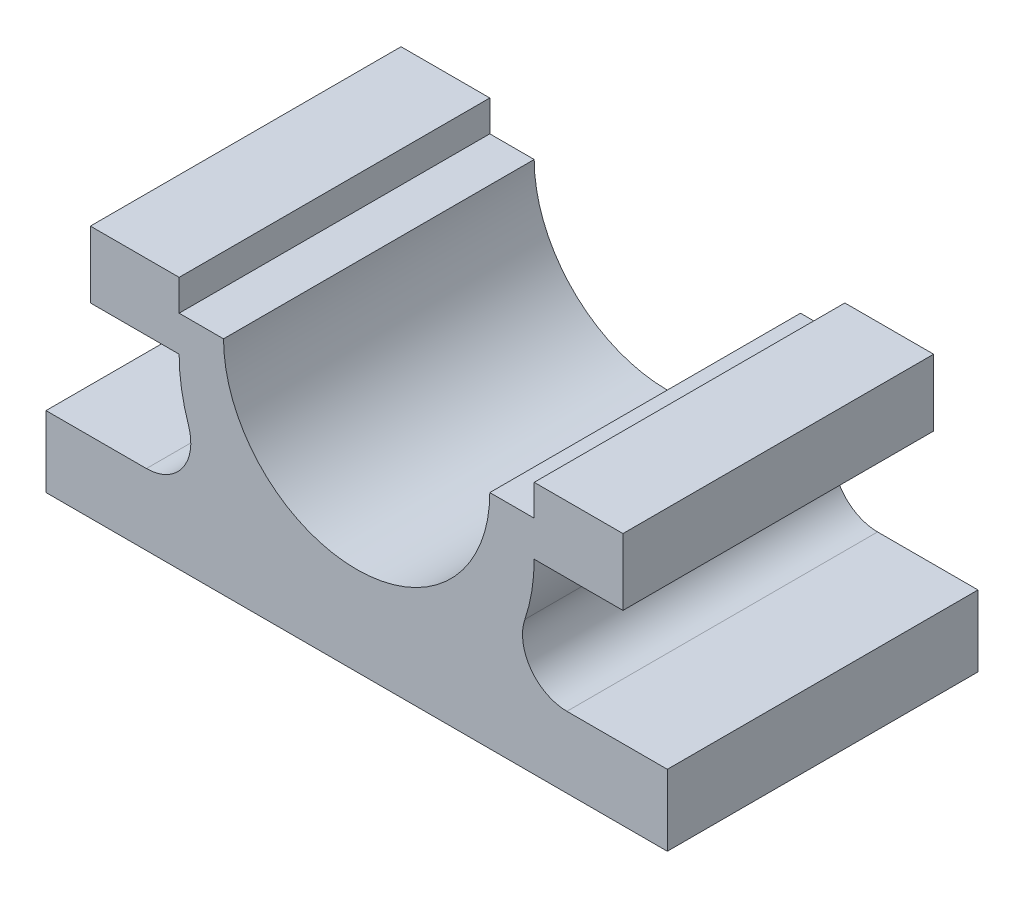
ISO-10303-21;
HEADER;
FILE_DESCRIPTION(('STEP AP214'),'2;1');
FILE_NAME('part.step','',(''),(''),'','','');
FILE_SCHEMA(('AUTOMOTIVE_DESIGN { 1 0 10303 214 1 1 1 1 }'));
ENDSEC;
DATA;
#1=APPLICATION_CONTEXT('core data for automotive mechanical design processes');
#2=APPLICATION_PROTOCOL_DEFINITION('international standard','automotive_design',2000,#1);
#3=PRODUCT_CONTEXT('',#1,'mechanical');
#4=PRODUCT('Part','Part','',(#3));
#5=PRODUCT_RELATED_PRODUCT_CATEGORY('part','',(#4));
#6=PRODUCT_DEFINITION_FORMATION('','',#4);
#7=PRODUCT_DEFINITION_CONTEXT('part definition',#1,'design');
#8=PRODUCT_DEFINITION('design','',#6,#7);
#9=PRODUCT_DEFINITION_SHAPE('','',#8);
#10=(LENGTH_UNIT() NAMED_UNIT(*) SI_UNIT(.MILLI.,.METRE.));
#11=(NAMED_UNIT(*) PLANE_ANGLE_UNIT() SI_UNIT($,.RADIAN.));
#12=(NAMED_UNIT(*) SI_UNIT($,.STERADIAN.) SOLID_ANGLE_UNIT());
#13=UNCERTAINTY_MEASURE_WITH_UNIT(LENGTH_MEASURE(1.E-05),#10,'distance_accuracy_value','');
#14=(GEOMETRIC_REPRESENTATION_CONTEXT(3) GLOBAL_UNCERTAINTY_ASSIGNED_CONTEXT((#13)) GLOBAL_UNIT_ASSIGNED_CONTEXT((#10,
#11,#12)) REPRESENTATION_CONTEXT('',''));
#15=CARTESIAN_POINT('',(0.,0.,0.));
#16=DIRECTION('',(0.,0.,1.));
#17=DIRECTION('',(1.,0.,0.));
#18=AXIS2_PLACEMENT_3D('',#15,#16,#17);
#19=CARTESIAN_POINT('',(0.,0.,105.));
#20=DIRECTION('',(0.,0.,-1.));
#21=DIRECTION('',(-1.,0.,0.));
#22=AXIS2_PLACEMENT_3D('',#19,#20,#21);
#23=CYLINDRICAL_SURFACE('',#22,90.);
#24=CARTESIAN_POINT('',(0.,0.,-105.));
#25=DIRECTION('',(0.,0.,-1.));
#26=DIRECTION('',(1.,0.,0.));
#27=AXIS2_PLACEMENT_3D('',#24,#25,#26);
#28=CIRCLE('',#27,90.);
#29=CARTESIAN_POINT('',(90.,0.,-105.));
#30=VERTEX_POINT('',#29);
#31=CARTESIAN_POINT('',(-90.,0.,-105.));
#32=VERTEX_POINT('',#31);
#33=EDGE_CURVE('E205',#30,#32,#28,.T.);
#34=ORIENTED_EDGE('',*,*,#33,.T.);
#35=DIRECTION('',(0.,0.,-1.));
#36=VECTOR('',#35,1.);
#37=CARTESIAN_POINT('',(-90.,0.,105.));
#38=LINE('',#37,#36);
#39=CARTESIAN_POINT('',(-90.,0.,105.));
#40=VERTEX_POINT('',#39);
#41=EDGE_CURVE('E11',#40,#32,#38,.T.);
#42=ORIENTED_EDGE('',*,*,#41,.F.);
#43=CARTESIAN_POINT('',(0.,0.,105.));
#44=DIRECTION('',(0.,0.,-1.));
#45=DIRECTION('',(1.,0.,0.));
#46=AXIS2_PLACEMENT_3D('',#43,#44,#45);
#47=CIRCLE('',#46,90.);
#48=CARTESIAN_POINT('',(90.,0.,105.));
#49=VERTEX_POINT('',#48);
#50=EDGE_CURVE('E243',#49,#40,#47,.T.);
#51=ORIENTED_EDGE('',*,*,#50,.F.);
#52=DIRECTION('',(0.,0.,-1.));
#53=VECTOR('',#52,1.);
#54=CARTESIAN_POINT('',(90.,0.,105.));
#55=LINE('',#54,#53);
#56=EDGE_CURVE('E201',#49,#30,#55,.T.);
#57=ORIENTED_EDGE('',*,*,#56,.T.);
#58=EDGE_LOOP('',(#34,#42,#51,#57));
#59=FACE_BOUND('',#58,.T.);
#60=ADVANCED_FACE('F37',(#59),#23,.F.);
#61=CARTESIAN_POINT('',(-90.,0.,105.));
#62=DIRECTION('',(0.,-1.,0.));
#63=DIRECTION('',(1.,0.,0.));
#64=AXIS2_PLACEMENT_3D('',#61,#62,#63);
#65=PLANE('',#64);
#66=DIRECTION('',(-1.,0.,0.));
#67=VECTOR('',#66,1.);
#68=CARTESIAN_POINT('',(-90.,0.,-105.));
#69=LINE('',#68,#67);
#70=CARTESIAN_POINT('',(-120.,0.,-105.));
#71=VERTEX_POINT('',#70);
#72=EDGE_CURVE('E208',#32,#71,#69,.T.);
#73=ORIENTED_EDGE('',*,*,#72,.T.);
#74=DIRECTION('',(0.,0.,-1.));
#75=VECTOR('',#74,1.);
#76=CARTESIAN_POINT('',(-120.,0.,105.));
#77=LINE('',#76,#75);
#78=CARTESIAN_POINT('',(-120.,0.,105.));
#79=VERTEX_POINT('',#78);
#80=EDGE_CURVE('E45',#79,#71,#77,.T.);
#81=ORIENTED_EDGE('',*,*,#80,.F.);
#82=DIRECTION('',(-1.,0.,0.));
#83=VECTOR('',#82,1.);
#84=CARTESIAN_POINT('',(-90.,0.,105.));
#85=LINE('',#84,#83);
#86=EDGE_CURVE('E132',#40,#79,#85,.T.);
#87=ORIENTED_EDGE('',*,*,#86,.F.);
#88=ORIENTED_EDGE('',*,*,#41,.T.);
#89=EDGE_LOOP('',(#73,#81,#87,#88));
#90=FACE_BOUND('',#89,.T.);
#91=ADVANCED_FACE('F361',(#90),#65,.F.);
#92=CARTESIAN_POINT('',(-120.,0.,105.));
#93=DIRECTION('',(-1.,0.,0.));
#94=DIRECTION('',(0.,0.,1.));
#95=AXIS2_PLACEMENT_3D('',#92,#93,#94);
#96=PLANE('',#95);
#97=DIRECTION('',(0.,1.,0.));
#98=VECTOR('',#97,1.);
#99=CARTESIAN_POINT('',(-120.,0.,-105.));
#100=LINE('',#99,#98);
#101=CARTESIAN_POINT('',(-120.,21.,-105.));
#102=VERTEX_POINT('',#101);
#103=EDGE_CURVE('E210',#71,#102,#100,.T.);
#104=ORIENTED_EDGE('',*,*,#103,.T.);
#105=DIRECTION('',(0.,0.,-1.));
#106=VECTOR('',#105,1.);
#107=CARTESIAN_POINT('',(-120.,21.,105.));
#108=LINE('',#107,#106);
#109=CARTESIAN_POINT('',(-120.,21.,105.));
#110=VERTEX_POINT('',#109);
#111=EDGE_CURVE('E286',#110,#102,#108,.T.);
#112=ORIENTED_EDGE('',*,*,#111,.F.);
#113=DIRECTION('',(0.,1.,0.));
#114=VECTOR('',#113,1.);
#115=CARTESIAN_POINT('',(-120.,0.,105.));
#116=LINE('',#115,#114);
#117=EDGE_CURVE('E294',#79,#110,#116,.T.);
#118=ORIENTED_EDGE('',*,*,#117,.F.);
#119=ORIENTED_EDGE('',*,*,#80,.T.);
#120=EDGE_LOOP('',(#104,#112,#118,#119));
#121=FACE_BOUND('',#120,.T.);
#122=ADVANCED_FACE('F292',(#121),#96,.F.);
#123=CARTESIAN_POINT('',(-120.,21.,105.));
#124=DIRECTION('',(0.,-1.,0.));
#125=DIRECTION('',(1.,0.,0.));
#126=AXIS2_PLACEMENT_3D('',#123,#124,#125);
#127=PLANE('',#126);
#128=DIRECTION('',(-1.,0.,0.));
#129=VECTOR('',#128,1.);
#130=CARTESIAN_POINT('',(-120.,21.,-105.));
#131=LINE('',#130,#129);
#132=CARTESIAN_POINT('',(-180.,21.,-105.));
#133=VERTEX_POINT('',#132);
#134=EDGE_CURVE('E212',#102,#133,#131,.T.);
#135=ORIENTED_EDGE('',*,*,#134,.T.);
#136=DIRECTION('',(0.,0.,-1.));
#137=VECTOR('',#136,1.);
#138=CARTESIAN_POINT('',(-180.,21.,105.));
#139=LINE('',#138,#137);
#140=CARTESIAN_POINT('',(-180.,21.,105.));
#141=VERTEX_POINT('',#140);
#142=EDGE_CURVE('E283',#141,#133,#139,.T.);
#143=ORIENTED_EDGE('',*,*,#142,.F.);
#144=DIRECTION('',(-1.,0.,0.));
#145=VECTOR('',#144,1.);
#146=CARTESIAN_POINT('',(-120.,21.,105.));
#147=LINE('',#146,#145);
#148=EDGE_CURVE('E312',#110,#141,#147,.T.);
#149=ORIENTED_EDGE('',*,*,#148,.F.);
#150=ORIENTED_EDGE('',*,*,#111,.T.);
#151=EDGE_LOOP('',(#135,#143,#149,#150));
#152=FACE_BOUND('',#151,.T.);
#153=ADVANCED_FACE('F303',(#152),#127,.F.);
#154=CARTESIAN_POINT('',(-180.,21.,105.));
#155=DIRECTION('',(1.,0.,0.));
#156=DIRECTION('',(0.,0.,-1.));
#157=AXIS2_PLACEMENT_3D('',#154,#155,#156);
#158=PLANE('',#157);
#159=DIRECTION('',(0.,-1.,0.));
#160=VECTOR('',#159,1.);
#161=CARTESIAN_POINT('',(-180.,21.,-105.));
#162=LINE('',#161,#160);
#163=CARTESIAN_POINT('',(-180.,-24.,-105.));
#164=VERTEX_POINT('',#163);
#165=EDGE_CURVE('E214',#133,#164,#162,.T.);
#166=ORIENTED_EDGE('',*,*,#165,.T.);
#167=DIRECTION('',(0.,0.,-1.));
#168=VECTOR('',#167,1.);
#169=CARTESIAN_POINT('',(-180.,-24.,105.));
#170=LINE('',#169,#168);
#171=CARTESIAN_POINT('',(-180.,-24.,105.));
#172=VERTEX_POINT('',#171);
#173=EDGE_CURVE('E280',#172,#164,#170,.T.);
#174=ORIENTED_EDGE('',*,*,#173,.F.);
#175=DIRECTION('',(0.,-1.,0.));
#176=VECTOR('',#175,1.);
#177=CARTESIAN_POINT('',(-180.,21.,105.));
#178=LINE('',#177,#176);
#179=EDGE_CURVE('E309',#141,#172,#178,.T.);
#180=ORIENTED_EDGE('',*,*,#179,.F.);
#181=ORIENTED_EDGE('',*,*,#142,.T.);
#182=EDGE_LOOP('',(#166,#174,#180,#181));
#183=FACE_BOUND('',#182,.T.);
#184=ADVANCED_FACE('F307',(#183),#158,.F.);
#185=CARTESIAN_POINT('',(-180.,-24.,105.));
#186=DIRECTION('',(0.,1.,0.));
#187=DIRECTION('',(-1.,0.,0.));
#188=AXIS2_PLACEMENT_3D('',#185,#186,#187);
#189=PLANE('',#188);
#190=DIRECTION('',(1.,0.,0.));
#191=VECTOR('',#190,1.);
#192=CARTESIAN_POINT('',(-180.,-24.,-105.));
#193=LINE('',#192,#191);
#194=CARTESIAN_POINT('',(-120.,-24.,-105.));
#195=VERTEX_POINT('',#194);
#196=EDGE_CURVE('E216',#164,#195,#193,.T.);
#197=ORIENTED_EDGE('',*,*,#196,.T.);
#198=DIRECTION('',(0.,0.,-1.));
#199=VECTOR('',#198,1.);
#200=CARTESIAN_POINT('',(-120.,-24.,105.));
#201=LINE('',#200,#199);
#202=CARTESIAN_POINT('',(-120.,-24.,105.));
#203=VERTEX_POINT('',#202);
#204=EDGE_CURVE('E277',#203,#195,#201,.T.);
#205=ORIENTED_EDGE('',*,*,#204,.F.);
#206=DIRECTION('',(1.,0.,0.));
#207=VECTOR('',#206,1.);
#208=CARTESIAN_POINT('',(-180.,-24.,105.));
#209=LINE('',#208,#207);
#210=EDGE_CURVE('E311',#172,#203,#209,.T.);
#211=ORIENTED_EDGE('',*,*,#210,.F.);
#212=ORIENTED_EDGE('',*,*,#173,.T.);
#213=EDGE_LOOP('',(#197,#205,#211,#212));
#214=FACE_BOUND('',#213,.T.);
#215=ADVANCED_FACE('F374',(#214),#189,.F.);
#216=CARTESIAN_POINT('',(0.,-24.,105.));
#217=DIRECTION('',(0.,0.,-1.));
#218=DIRECTION('',(-1.,0.,0.));
#219=AXIS2_PLACEMENT_3D('',#216,#217,#218);
#220=CYLINDRICAL_SURFACE('',#219,120.);
#221=CARTESIAN_POINT('',(0.,-24.,-105.));
#222=DIRECTION('',(0.,0.,1.));
#223=DIRECTION('',(1.,0.,0.));
#224=AXIS2_PLACEMENT_3D('',#221,#222,#223);
#225=CIRCLE('',#224,120.);
#226=CARTESIAN_POINT('',(-113.690105110339,-62.4,-105.));
#227=VERTEX_POINT('',#226);
#228=EDGE_CURVE('E218',#195,#227,#225,.T.);
#229=ORIENTED_EDGE('',*,*,#228,.T.);
#230=DIRECTION('',(0.,0.,-1.));
#231=VECTOR('',#230,1.);
#232=CARTESIAN_POINT('',(-113.690105110339,-62.4,105.));
#233=LINE('',#232,#231);
#234=CARTESIAN_POINT('',(-113.690105110339,-62.4,105.));
#235=VERTEX_POINT('',#234);
#236=EDGE_CURVE('E274',#235,#227,#233,.T.);
#237=ORIENTED_EDGE('',*,*,#236,.F.);
#238=CARTESIAN_POINT('',(0.,-24.,105.));
#239=DIRECTION('',(0.,0.,1.));
#240=DIRECTION('',(1.,0.,0.));
#241=AXIS2_PLACEMENT_3D('',#238,#239,#240);
#242=CIRCLE('',#241,120.);
#243=EDGE_CURVE('E314',#203,#235,#242,.T.);
#244=ORIENTED_EDGE('',*,*,#243,.F.);
#245=ORIENTED_EDGE('',*,*,#204,.T.);
#246=EDGE_LOOP('',(#229,#237,#244,#245));
#247=FACE_BOUND('',#246,.T.);
#248=ADVANCED_FACE('F377',(#247),#220,.T.);
#249=CARTESIAN_POINT('',(-142.112631387924,-72.,105.));
#250=DIRECTION('',(0.,0.,-1.));
#251=DIRECTION('',(-1.,0.,0.));
#252=AXIS2_PLACEMENT_3D('',#249,#250,#251);
#253=CYLINDRICAL_SURFACE('',#252,30.);
#254=CARTESIAN_POINT('',(-142.112631387924,-72.,-105.));
#255=DIRECTION('',(0.,0.,-1.));
#256=DIRECTION('',(1.,0.,0.));
#257=AXIS2_PLACEMENT_3D('',#254,#255,#256);
#258=CIRCLE('',#257,30.);
#259=CARTESIAN_POINT('',(-142.112631387924,-102.,-105.));
#260=VERTEX_POINT('',#259);
#261=EDGE_CURVE('E220',#227,#260,#258,.T.);
#262=ORIENTED_EDGE('',*,*,#261,.T.);
#263=DIRECTION('',(0.,0.,-1.));
#264=VECTOR('',#263,1.);
#265=CARTESIAN_POINT('',(-142.112631387924,-102.,105.));
#266=LINE('',#265,#264);
#267=CARTESIAN_POINT('',(-142.112631387924,-102.,105.));
#268=VERTEX_POINT('',#267);
#269=EDGE_CURVE('E271',#268,#260,#266,.T.);
#270=ORIENTED_EDGE('',*,*,#269,.F.);
#271=CARTESIAN_POINT('',(-142.112631387924,-72.,105.));
#272=DIRECTION('',(0.,0.,-1.));
#273=DIRECTION('',(1.,0.,0.));
#274=AXIS2_PLACEMENT_3D('',#271,#272,#273);
#275=CIRCLE('',#274,30.);
#276=EDGE_CURVE('E320',#235,#268,#275,.T.);
#277=ORIENTED_EDGE('',*,*,#276,.F.);
#278=ORIENTED_EDGE('',*,*,#236,.T.);
#279=EDGE_LOOP('',(#262,#270,#277,#278));
#280=FACE_BOUND('',#279,.T.);
#281=ADVANCED_FACE('F381',(#280),#253,.F.);
#282=CARTESIAN_POINT('',(-142.112631387924,-102.,105.));
#283=DIRECTION('',(0.,-1.,0.));
#284=DIRECTION('',(1.,0.,0.));
#285=AXIS2_PLACEMENT_3D('',#282,#283,#284);
#286=PLANE('',#285);
#287=DIRECTION('',(-1.,0.,0.));
#288=VECTOR('',#287,1.);
#289=CARTESIAN_POINT('',(-142.112631387924,-102.,-105.));
#290=LINE('',#289,#288);
#291=CARTESIAN_POINT('',(-210.,-102.,-105.));
#292=VERTEX_POINT('',#291);
#293=EDGE_CURVE('E222',#260,#292,#290,.T.);
#294=ORIENTED_EDGE('',*,*,#293,.T.);
#295=DIRECTION('',(0.,0.,-1.));
#296=VECTOR('',#295,1.);
#297=CARTESIAN_POINT('',(-210.,-102.,105.));
#298=LINE('',#297,#296);
#299=CARTESIAN_POINT('',(-210.,-102.,105.));
#300=VERTEX_POINT('',#299);
#301=EDGE_CURVE('E268',#300,#292,#298,.T.);
#302=ORIENTED_EDGE('',*,*,#301,.F.);
#303=DIRECTION('',(-1.,0.,0.));
#304=VECTOR('',#303,1.);
#305=CARTESIAN_POINT('',(-142.112631387924,-102.,105.));
#306=LINE('',#305,#304);
#307=EDGE_CURVE('E322',#268,#300,#306,.T.);
#308=ORIENTED_EDGE('',*,*,#307,.F.);
#309=ORIENTED_EDGE('',*,*,#269,.T.);
#310=EDGE_LOOP('',(#294,#302,#308,#309));
#311=FACE_BOUND('',#310,.T.);
#312=ADVANCED_FACE('F385',(#311),#286,.F.);
#313=CARTESIAN_POINT('',(-210.,-102.,105.));
#314=DIRECTION('',(1.,0.,0.));
#315=DIRECTION('',(0.,0.,-1.));
#316=AXIS2_PLACEMENT_3D('',#313,#314,#315);
#317=PLANE('',#316);
#318=DIRECTION('',(0.,-1.,0.));
#319=VECTOR('',#318,1.);
#320=CARTESIAN_POINT('',(-210.,-102.,-105.));
#321=LINE('',#320,#319);
#322=CARTESIAN_POINT('',(-210.,-150.,-105.));
#323=VERTEX_POINT('',#322);
#324=EDGE_CURVE('E224',#292,#323,#321,.T.);
#325=ORIENTED_EDGE('',*,*,#324,.T.);
#326=DIRECTION('',(0.,0.,-1.));
#327=VECTOR('',#326,1.);
#328=CARTESIAN_POINT('',(-210.,-150.,105.));
#329=LINE('',#328,#327);
#330=CARTESIAN_POINT('',(-210.,-150.,105.));
#331=VERTEX_POINT('',#330);
#332=EDGE_CURVE('E265',#331,#323,#329,.T.);
#333=ORIENTED_EDGE('',*,*,#332,.F.);
#334=DIRECTION('',(0.,-1.,0.));
#335=VECTOR('',#334,1.);
#336=CARTESIAN_POINT('',(-210.,-102.,105.));
#337=LINE('',#336,#335);
#338=EDGE_CURVE('E324',#300,#331,#337,.T.);
#339=ORIENTED_EDGE('',*,*,#338,.F.);
#340=ORIENTED_EDGE('',*,*,#301,.T.);
#341=EDGE_LOOP('',(#325,#333,#339,#340));
#342=FACE_BOUND('',#341,.T.);
#343=ADVANCED_FACE('F389',(#342),#317,.F.);
#344=CARTESIAN_POINT('',(-210.,-150.,105.));
#345=DIRECTION('',(0.,1.,0.));
#346=DIRECTION('',(-1.,0.,0.));
#347=AXIS2_PLACEMENT_3D('',#344,#345,#346);
#348=PLANE('',#347);
#349=DIRECTION('',(1.,0.,0.));
#350=VECTOR('',#349,1.);
#351=CARTESIAN_POINT('',(-210.,-150.,-105.));
#352=LINE('',#351,#350);
#353=CARTESIAN_POINT('',(210.,-150.,-105.));
#354=VERTEX_POINT('',#353);
#355=EDGE_CURVE('E226',#323,#354,#352,.T.);
#356=ORIENTED_EDGE('',*,*,#355,.T.);
#357=DIRECTION('',(0.,0.,-1.));
#358=VECTOR('',#357,1.);
#359=CARTESIAN_POINT('',(210.,-150.,105.));
#360=LINE('',#359,#358);
#361=CARTESIAN_POINT('',(210.,-150.,105.));
#362=VERTEX_POINT('',#361);
#363=EDGE_CURVE('E262',#362,#354,#360,.T.);
#364=ORIENTED_EDGE('',*,*,#363,.F.);
#365=DIRECTION('',(1.,0.,0.));
#366=VECTOR('',#365,1.);
#367=CARTESIAN_POINT('',(-210.,-150.,105.));
#368=LINE('',#367,#366);
#369=EDGE_CURVE('E326',#331,#362,#368,.T.);
#370=ORIENTED_EDGE('',*,*,#369,.F.);
#371=ORIENTED_EDGE('',*,*,#332,.T.);
#372=EDGE_LOOP('',(#356,#364,#370,#371));
#373=FACE_BOUND('',#372,.T.);
#374=ADVANCED_FACE('F393',(#373),#348,.F.);
#375=CARTESIAN_POINT('',(210.,-150.,105.));
#376=DIRECTION('',(-1.,0.,0.));
#377=DIRECTION('',(0.,0.,1.));
#378=AXIS2_PLACEMENT_3D('',#375,#376,#377);
#379=PLANE('',#378);
#380=DIRECTION('',(0.,1.,0.));
#381=VECTOR('',#380,1.);
#382=CARTESIAN_POINT('',(210.,-150.,-105.));
#383=LINE('',#382,#381);
#384=CARTESIAN_POINT('',(210.,-102.,-105.));
#385=VERTEX_POINT('',#384);
#386=EDGE_CURVE('E228',#354,#385,#383,.T.);
#387=ORIENTED_EDGE('',*,*,#386,.T.);
#388=DIRECTION('',(0.,0.,-1.));
#389=VECTOR('',#388,1.);
#390=CARTESIAN_POINT('',(210.,-102.,105.));
#391=LINE('',#390,#389);
#392=CARTESIAN_POINT('',(210.,-102.,105.));
#393=VERTEX_POINT('',#392);
#394=EDGE_CURVE('E259',#393,#385,#391,.T.);
#395=ORIENTED_EDGE('',*,*,#394,.F.);
#396=DIRECTION('',(0.,1.,0.));
#397=VECTOR('',#396,1.);
#398=CARTESIAN_POINT('',(210.,-150.,105.));
#399=LINE('',#398,#397);
#400=EDGE_CURVE('E328',#362,#393,#399,.T.);
#401=ORIENTED_EDGE('',*,*,#400,.F.);
#402=ORIENTED_EDGE('',*,*,#363,.T.);
#403=EDGE_LOOP('',(#387,#395,#401,#402));
#404=FACE_BOUND('',#403,.T.);
#405=ADVANCED_FACE('F397',(#404),#379,.F.);
#406=CARTESIAN_POINT('',(142.112631387924,-102.,105.));
#407=DIRECTION('',(0.,-1.,0.));
#408=DIRECTION('',(0.,0.,-1.));
#409=AXIS2_PLACEMENT_3D('',#406,#407,#408);
#410=PLANE('',#409);
#411=DIRECTION('',(-1.,0.,0.));
#412=VECTOR('',#411,1.);
#413=CARTESIAN_POINT('',(142.112631387924,-102.,-105.));
#414=LINE('',#413,#412);
#415=CARTESIAN_POINT('',(142.112631387924,-102.,-105.));
#416=VERTEX_POINT('',#415);
#417=EDGE_CURVE('E230',#385,#416,#414,.T.);
#418=ORIENTED_EDGE('',*,*,#417,.T.);
#419=DIRECTION('',(0.,0.,-1.));
#420=VECTOR('',#419,1.);
#421=CARTESIAN_POINT('',(142.112631387924,-102.,105.));
#422=LINE('',#421,#420);
#423=CARTESIAN_POINT('',(142.112631387924,-102.,105.));
#424=VERTEX_POINT('',#423);
#425=EDGE_CURVE('E256',#424,#416,#422,.T.);
#426=ORIENTED_EDGE('',*,*,#425,.F.);
#427=DIRECTION('',(-1.,0.,0.));
#428=VECTOR('',#427,1.);
#429=CARTESIAN_POINT('',(142.112631387924,-102.,105.));
#430=LINE('',#429,#428);
#431=EDGE_CURVE('E330',#393,#424,#430,.T.);
#432=ORIENTED_EDGE('',*,*,#431,.F.);
#433=ORIENTED_EDGE('',*,*,#394,.T.);
#434=EDGE_LOOP('',(#418,#426,#432,#433));
#435=FACE_BOUND('',#434,.T.);
#436=ADVANCED_FACE('F401',(#435),#410,.F.);
#437=CARTESIAN_POINT('',(142.112631387924,-72.,105.));
#438=DIRECTION('',(0.,0.,-1.));
#439=DIRECTION('',(-1.,0.,0.));
#440=AXIS2_PLACEMENT_3D('',#437,#438,#439);
#441=CYLINDRICAL_SURFACE('',#440,30.);
#442=CARTESIAN_POINT('',(142.112631387924,-72.,-105.));
#443=DIRECTION('',(0.,0.,-1.));
#444=DIRECTION('',(1.,0.,0.));
#445=AXIS2_PLACEMENT_3D('',#442,#443,#444);
#446=CIRCLE('',#445,30.);
#447=CARTESIAN_POINT('',(113.690105110339,-62.4,-105.));
#448=VERTEX_POINT('',#447);
#449=EDGE_CURVE('E232',#416,#448,#446,.T.);
#450=ORIENTED_EDGE('',*,*,#449,.T.);
#451=DIRECTION('',(0.,0.,-1.));
#452=VECTOR('',#451,1.);
#453=CARTESIAN_POINT('',(113.690105110339,-62.4,105.));
#454=LINE('',#453,#452);
#455=CARTESIAN_POINT('',(113.690105110339,-62.4,105.));
#456=VERTEX_POINT('',#455);
#457=EDGE_CURVE('E253',#456,#448,#454,.T.);
#458=ORIENTED_EDGE('',*,*,#457,.F.);
#459=CARTESIAN_POINT('',(142.112631387924,-72.,105.));
#460=DIRECTION('',(0.,0.,-1.));
#461=DIRECTION('',(1.,0.,0.));
#462=AXIS2_PLACEMENT_3D('',#459,#460,#461);
#463=CIRCLE('',#462,30.);
#464=EDGE_CURVE('E332',#424,#456,#463,.T.);
#465=ORIENTED_EDGE('',*,*,#464,.F.);
#466=ORIENTED_EDGE('',*,*,#425,.T.);
#467=EDGE_LOOP('',(#450,#458,#465,#466));
#468=FACE_BOUND('',#467,.T.);
#469=ADVANCED_FACE('F405',(#468),#441,.F.);
#470=CARTESIAN_POINT('',(0.,-24.,105.));
#471=DIRECTION('',(0.,0.,-1.));
#472=DIRECTION('',(-1.,0.,0.));
#473=AXIS2_PLACEMENT_3D('',#470,#471,#472);
#474=CYLINDRICAL_SURFACE('',#473,120.);
#475=CARTESIAN_POINT('',(0.,-24.,-105.));
#476=DIRECTION('',(0.,0.,1.));
#477=DIRECTION('',(1.,0.,0.));
#478=AXIS2_PLACEMENT_3D('',#475,#476,#477);
#479=CIRCLE('',#478,120.);
#480=CARTESIAN_POINT('',(120.,-24.,-105.));
#481=VERTEX_POINT('',#480);
#482=EDGE_CURVE('E234',#448,#481,#479,.T.);
#483=ORIENTED_EDGE('',*,*,#482,.T.);
#484=DIRECTION('',(0.,0.,-1.));
#485=VECTOR('',#484,1.);
#486=CARTESIAN_POINT('',(120.,-24.,105.));
#487=LINE('',#486,#485);
#488=CARTESIAN_POINT('',(120.,-24.,105.));
#489=VERTEX_POINT('',#488);
#490=EDGE_CURVE('E250',#489,#481,#487,.T.);
#491=ORIENTED_EDGE('',*,*,#490,.F.);
#492=CARTESIAN_POINT('',(0.,-24.,105.));
#493=DIRECTION('',(0.,0.,1.));
#494=DIRECTION('',(1.,0.,0.));
#495=AXIS2_PLACEMENT_3D('',#492,#493,#494);
#496=CIRCLE('',#495,120.);
#497=EDGE_CURVE('E334',#456,#489,#496,.T.);
#498=ORIENTED_EDGE('',*,*,#497,.F.);
#499=ORIENTED_EDGE('',*,*,#457,.T.);
#500=EDGE_LOOP('',(#483,#491,#498,#499));
#501=FACE_BOUND('',#500,.T.);
#502=ADVANCED_FACE('F409',(#501),#474,.T.);
#503=CARTESIAN_POINT('',(180.,-24.,105.));
#504=DIRECTION('',(0.,1.,0.));
#505=DIRECTION('',(-1.,0.,0.));
#506=AXIS2_PLACEMENT_3D('',#503,#504,#505);
#507=PLANE('',#506);
#508=DIRECTION('',(1.,0.,0.));
#509=VECTOR('',#508,1.);
#510=CARTESIAN_POINT('',(180.,-24.,-105.));
#511=LINE('',#510,#509);
#512=CARTESIAN_POINT('',(180.,-24.,-105.));
#513=VERTEX_POINT('',#512);
#514=EDGE_CURVE('E236',#481,#513,#511,.T.);
#515=ORIENTED_EDGE('',*,*,#514,.T.);
#516=DIRECTION('',(0.,0.,-1.));
#517=VECTOR('',#516,1.);
#518=CARTESIAN_POINT('',(180.,-24.,105.));
#519=LINE('',#518,#517);
#520=CARTESIAN_POINT('',(180.,-24.,105.));
#521=VERTEX_POINT('',#520);
#522=EDGE_CURVE('E247',#521,#513,#519,.T.);
#523=ORIENTED_EDGE('',*,*,#522,.F.);
#524=DIRECTION('',(1.,0.,0.));
#525=VECTOR('',#524,1.);
#526=CARTESIAN_POINT('',(180.,-24.,105.));
#527=LINE('',#526,#525);
#528=EDGE_CURVE('E336',#489,#521,#527,.T.);
#529=ORIENTED_EDGE('',*,*,#528,.F.);
#530=ORIENTED_EDGE('',*,*,#490,.T.);
#531=EDGE_LOOP('',(#515,#523,#529,#530));
#532=FACE_BOUND('',#531,.T.);
#533=ADVANCED_FACE('F342',(#532),#507,.F.);
#534=CARTESIAN_POINT('',(180.,21.,105.));
#535=DIRECTION('',(-1.,0.,0.));
#536=DIRECTION('',(0.,0.,1.));
#537=AXIS2_PLACEMENT_3D('',#534,#535,#536);
#538=PLANE('',#537);
#539=DIRECTION('',(0.,1.,0.));
#540=VECTOR('',#539,1.);
#541=CARTESIAN_POINT('',(180.,21.,-105.));
#542=LINE('',#541,#540);
#543=CARTESIAN_POINT('',(180.,21.,-105.));
#544=VERTEX_POINT('',#543);
#545=EDGE_CURVE('E238',#513,#544,#542,.T.);
#546=ORIENTED_EDGE('',*,*,#545,.T.);
#547=DIRECTION('',(0.,0.,-1.));
#548=VECTOR('',#547,1.);
#549=CARTESIAN_POINT('',(180.,21.,105.));
#550=LINE('',#549,#548);
#551=CARTESIAN_POINT('',(180.,21.,105.));
#552=VERTEX_POINT('',#551);
#553=EDGE_CURVE('E196',#552,#544,#550,.T.);
#554=ORIENTED_EDGE('',*,*,#553,.F.);
#555=DIRECTION('',(0.,1.,0.));
#556=VECTOR('',#555,1.);
#557=CARTESIAN_POINT('',(180.,21.,105.));
#558=LINE('',#557,#556);
#559=EDGE_CURVE('E187',#521,#552,#558,.T.);
#560=ORIENTED_EDGE('',*,*,#559,.F.);
#561=ORIENTED_EDGE('',*,*,#522,.T.);
#562=EDGE_LOOP('',(#546,#554,#560,#561));
#563=FACE_BOUND('',#562,.T.);
#564=ADVANCED_FACE('F346',(#563),#538,.F.);
#565=CARTESIAN_POINT('',(120.,21.,105.));
#566=DIRECTION('',(0.,-1.,0.));
#567=DIRECTION('',(1.,0.,0.));
#568=AXIS2_PLACEMENT_3D('',#565,#566,#567);
#569=PLANE('',#568);
#570=DIRECTION('',(-1.,0.,0.));
#571=VECTOR('',#570,1.);
#572=CARTESIAN_POINT('',(120.,21.,-105.));
#573=LINE('',#572,#571);
#574=CARTESIAN_POINT('',(120.,21.,-105.));
#575=VERTEX_POINT('',#574);
#576=EDGE_CURVE('E195',#544,#575,#573,.T.);
#577=ORIENTED_EDGE('',*,*,#576,.T.);
#578=DIRECTION('',(0.,0.,-1.));
#579=VECTOR('',#578,1.);
#580=CARTESIAN_POINT('',(120.,21.,105.));
#581=LINE('',#580,#579);
#582=CARTESIAN_POINT('',(120.,21.,105.));
#583=VERTEX_POINT('',#582);
#584=EDGE_CURVE('E192',#583,#575,#581,.T.);
#585=ORIENTED_EDGE('',*,*,#584,.F.);
#586=DIRECTION('',(-1.,0.,0.));
#587=VECTOR('',#586,1.);
#588=CARTESIAN_POINT('',(120.,21.,105.));
#589=LINE('',#588,#587);
#590=EDGE_CURVE('E181',#552,#583,#589,.T.);
#591=ORIENTED_EDGE('',*,*,#590,.F.);
#592=ORIENTED_EDGE('',*,*,#553,.T.);
#593=EDGE_LOOP('',(#577,#585,#591,#592));
#594=FACE_BOUND('',#593,.T.);
#595=ADVANCED_FACE('F193',(#594),#569,.F.);
#596=CARTESIAN_POINT('',(120.,0.,105.));
#597=DIRECTION('',(1.,0.,0.));
#598=DIRECTION('',(0.,0.,-1.));
#599=AXIS2_PLACEMENT_3D('',#596,#597,#598);
#600=PLANE('',#599);
#601=DIRECTION('',(0.,-1.,0.));
#602=VECTOR('',#601,1.);
#603=CARTESIAN_POINT('',(120.,0.,-105.));
#604=LINE('',#603,#602);
#605=CARTESIAN_POINT('',(120.,0.,-105.));
#606=VERTEX_POINT('',#605);
#607=EDGE_CURVE('E118',#575,#606,#604,.T.);
#608=ORIENTED_EDGE('',*,*,#607,.T.);
#609=DIRECTION('',(0.,0.,-1.));
#610=VECTOR('',#609,1.);
#611=CARTESIAN_POINT('',(120.,0.,105.));
#612=LINE('',#611,#610);
#613=CARTESIAN_POINT('',(120.,0.,105.));
#614=VERTEX_POINT('',#613);
#615=EDGE_CURVE('E197',#614,#606,#612,.T.);
#616=ORIENTED_EDGE('',*,*,#615,.F.);
#617=DIRECTION('',(0.,-1.,0.));
#618=VECTOR('',#617,1.);
#619=CARTESIAN_POINT('',(120.,0.,105.));
#620=LINE('',#619,#618);
#621=EDGE_CURVE('E185',#583,#614,#620,.T.);
#622=ORIENTED_EDGE('',*,*,#621,.F.);
#623=ORIENTED_EDGE('',*,*,#584,.T.);
#624=EDGE_LOOP('',(#608,#616,#622,#623));
#625=FACE_BOUND('',#624,.T.);
#626=ADVANCED_FACE('F199',(#625),#600,.F.);
#627=CARTESIAN_POINT('',(90.,0.,105.));
#628=DIRECTION('',(0.,-1.,0.));
#629=DIRECTION('',(1.,0.,0.));
#630=AXIS2_PLACEMENT_3D('',#627,#628,#629);
#631=PLANE('',#630);
#632=DIRECTION('',(-1.,0.,0.));
#633=VECTOR('',#632,1.);
#634=CARTESIAN_POINT('',(90.,0.,-105.));
#635=LINE('',#634,#633);
#636=EDGE_CURVE('E124',#606,#30,#635,.T.);
#637=ORIENTED_EDGE('',*,*,#636,.T.);
#638=ORIENTED_EDGE('',*,*,#56,.F.);
#639=DIRECTION('',(-1.,0.,0.));
#640=VECTOR('',#639,1.);
#641=CARTESIAN_POINT('',(90.,0.,105.));
#642=LINE('',#641,#640);
#643=EDGE_CURVE('E53',#614,#49,#642,.T.);
#644=ORIENTED_EDGE('',*,*,#643,.F.);
#645=ORIENTED_EDGE('',*,*,#615,.T.);
#646=EDGE_LOOP('',(#637,#638,#644,#645));
#647=FACE_BOUND('',#646,.T.);
#648=ADVANCED_FACE('F350',(#647),#631,.F.);
#649=CARTESIAN_POINT('',(0.,0.,105.));
#650=DIRECTION('',(0.,0.,1.));
#651=DIRECTION('',(1.,0.,0.));
#652=AXIS2_PLACEMENT_3D('',#649,#650,#651);
#653=PLANE('',#652);
#654=ORIENTED_EDGE('',*,*,#50,.T.);
#655=ORIENTED_EDGE('',*,*,#86,.T.);
#656=ORIENTED_EDGE('',*,*,#117,.T.);
#657=ORIENTED_EDGE('',*,*,#148,.T.);
#658=ORIENTED_EDGE('',*,*,#179,.T.);
#659=ORIENTED_EDGE('',*,*,#210,.T.);
#660=ORIENTED_EDGE('',*,*,#243,.T.);
#661=ORIENTED_EDGE('',*,*,#276,.T.);
#662=ORIENTED_EDGE('',*,*,#307,.T.);
#663=ORIENTED_EDGE('',*,*,#338,.T.);
#664=ORIENTED_EDGE('',*,*,#369,.T.);
#665=ORIENTED_EDGE('',*,*,#400,.T.);
#666=ORIENTED_EDGE('',*,*,#431,.T.);
#667=ORIENTED_EDGE('',*,*,#464,.T.);
#668=ORIENTED_EDGE('',*,*,#497,.T.);
#669=ORIENTED_EDGE('',*,*,#528,.T.);
#670=ORIENTED_EDGE('',*,*,#559,.T.);
#671=ORIENTED_EDGE('',*,*,#590,.T.);
#672=ORIENTED_EDGE('',*,*,#621,.T.);
#673=ORIENTED_EDGE('',*,*,#643,.T.);
#674=EDGE_LOOP('',(#654,#655,#656,#657,#658,#659,#660,#661,#662,#663,#664,#665,#666,#667,#668,
#669,#670,#671,#672,#673));
#675=FACE_BOUND('',#674,.T.);
#676=ADVANCED_FACE('F183',(#675),#653,.T.);
#677=CARTESIAN_POINT('',(0.,0.,-105.));
#678=DIRECTION('',(0.,0.,1.));
#679=DIRECTION('',(1.,0.,0.));
#680=AXIS2_PLACEMENT_3D('',#677,#678,#679);
#681=PLANE('',#680);
#682=ORIENTED_EDGE('',*,*,#33,.F.);
#683=ORIENTED_EDGE('',*,*,#636,.F.);
#684=ORIENTED_EDGE('',*,*,#607,.F.);
#685=ORIENTED_EDGE('',*,*,#576,.F.);
#686=ORIENTED_EDGE('',*,*,#545,.F.);
#687=ORIENTED_EDGE('',*,*,#514,.F.);
#688=ORIENTED_EDGE('',*,*,#482,.F.);
#689=ORIENTED_EDGE('',*,*,#449,.F.);
#690=ORIENTED_EDGE('',*,*,#417,.F.);
#691=ORIENTED_EDGE('',*,*,#386,.F.);
#692=ORIENTED_EDGE('',*,*,#355,.F.);
#693=ORIENTED_EDGE('',*,*,#324,.F.);
#694=ORIENTED_EDGE('',*,*,#293,.F.);
#695=ORIENTED_EDGE('',*,*,#261,.F.);
#696=ORIENTED_EDGE('',*,*,#228,.F.);
#697=ORIENTED_EDGE('',*,*,#196,.F.);
#698=ORIENTED_EDGE('',*,*,#165,.F.);
#699=ORIENTED_EDGE('',*,*,#134,.F.);
#700=ORIENTED_EDGE('',*,*,#103,.F.);
#701=ORIENTED_EDGE('',*,*,#72,.F.);
#702=EDGE_LOOP('',(#682,#683,#684,#685,#686,#687,#688,#689,#690,#691,#692,#693,#694,#695,#696,
#697,#698,#699,#700,#701));
#703=FACE_BOUND('',#702,.T.);
#704=ADVANCED_FACE('F298',(#703),#681,.F.);
#705=CLOSED_SHELL('',(#60,#91,#122,#153,#184,#215,#248,#281,#312,#343,#374,#405,#436,#469,#502,
#533,#564,#595,#626,#648,#676,#704));
#706=MANIFOLD_SOLID_BREP('B2',#705);
#707=ADVANCED_BREP_SHAPE_REPRESENTATION('',(#18,#706),#14);
#708=SHAPE_DEFINITION_REPRESENTATION(#9,#707);
ENDSEC;
END-ISO-10303-21;
